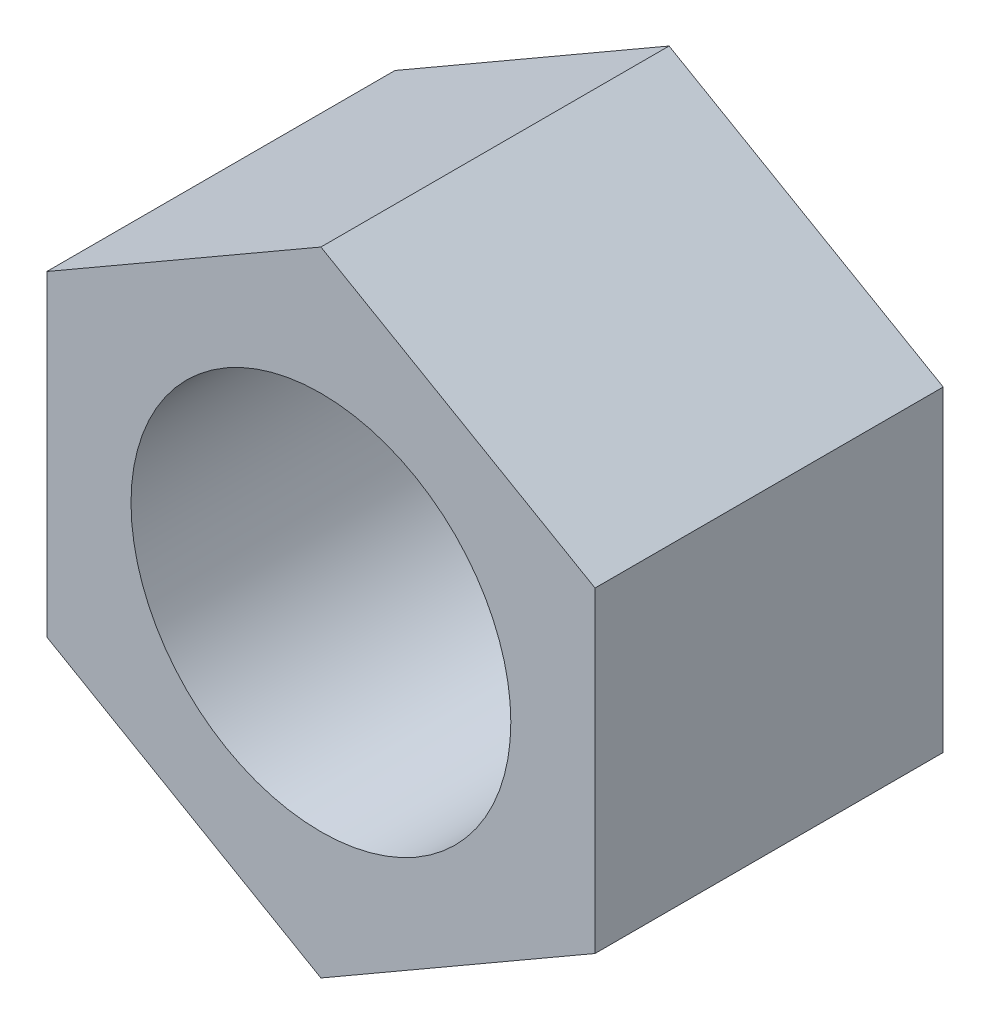
ISO-10303-21;
HEADER;
FILE_DESCRIPTION(('STEP AP214'),'2;1');
FILE_NAME('part.step','',(''),(''),'','','');
FILE_SCHEMA(('AUTOMOTIVE_DESIGN { 1 0 10303 214 1 1 1 1 }'));
ENDSEC;
DATA;
#1=APPLICATION_CONTEXT('core data for automotive mechanical design processes');
#2=APPLICATION_PROTOCOL_DEFINITION('international standard','automotive_design',2000,#1);
#3=PRODUCT_CONTEXT('',#1,'mechanical');
#4=PRODUCT('Part','Part','',(#3));
#5=PRODUCT_RELATED_PRODUCT_CATEGORY('part','',(#4));
#6=PRODUCT_DEFINITION_FORMATION('','',#4);
#7=PRODUCT_DEFINITION_CONTEXT('part definition',#1,'design');
#8=PRODUCT_DEFINITION('design','',#6,#7);
#9=PRODUCT_DEFINITION_SHAPE('','',#8);
#10=(LENGTH_UNIT() NAMED_UNIT(*) SI_UNIT(.MILLI.,.METRE.));
#11=(NAMED_UNIT(*) PLANE_ANGLE_UNIT() SI_UNIT($,.RADIAN.));
#12=(NAMED_UNIT(*) SI_UNIT($,.STERADIAN.) SOLID_ANGLE_UNIT());
#13=UNCERTAINTY_MEASURE_WITH_UNIT(LENGTH_MEASURE(1.E-05),#10,'distance_accuracy_value','');
#14=(GEOMETRIC_REPRESENTATION_CONTEXT(3) GLOBAL_UNCERTAINTY_ASSIGNED_CONTEXT((#13)) GLOBAL_UNIT_ASSIGNED_CONTEXT((#10,
#11,#12)) REPRESENTATION_CONTEXT('',''));
#15=CARTESIAN_POINT('',(0.,0.,0.));
#16=DIRECTION('',(0.,0.,1.));
#17=DIRECTION('',(1.,0.,0.));
#18=AXIS2_PLACEMENT_3D('',#15,#16,#17);
#19=CARTESIAN_POINT('',(4.33012701892216,2.50000000000005,5.5));
#20=DIRECTION('',(-0.499999999999995,-0.866025403784441,0.));
#21=DIRECTION('',(0.866025403784441,-0.499999999999995,0.));
#22=AXIS2_PLACEMENT_3D('',#19,#20,#21);
#23=PLANE('',#22);
#24=DIRECTION('',(-0.866025403784441,0.499999999999995,0.));
#25=VECTOR('',#24,1.);
#26=CARTESIAN_POINT('',(4.33012701892216,2.50000000000005,0.));
#27=LINE('',#26,#25);
#28=CARTESIAN_POINT('',(4.33012701892216,2.50000000000005,0.));
#29=VERTEX_POINT('',#28);
#30=CARTESIAN_POINT('',(0.,5.,0.));
#31=VERTEX_POINT('',#30);
#32=EDGE_CURVE('E134',#29,#31,#27,.T.);
#33=ORIENTED_EDGE('',*,*,#32,.T.);
#34=DIRECTION('',(0.,0.,-1.));
#35=VECTOR('',#34,1.);
#36=CARTESIAN_POINT('',(0.,5.,5.5));
#37=LINE('',#36,#35);
#38=CARTESIAN_POINT('',(0.,5.,5.5));
#39=VERTEX_POINT('',#38);
#40=EDGE_CURVE('E11',#39,#31,#37,.T.);
#41=ORIENTED_EDGE('',*,*,#40,.F.);
#42=DIRECTION('',(-0.866025403784441,0.499999999999995,0.));
#43=VECTOR('',#42,1.);
#44=CARTESIAN_POINT('',(4.33012701892216,2.50000000000005,5.5));
#45=LINE('',#44,#43);
#46=CARTESIAN_POINT('',(4.33012701892216,2.50000000000005,5.5));
#47=VERTEX_POINT('',#46);
#48=EDGE_CURVE('E151',#47,#39,#45,.T.);
#49=ORIENTED_EDGE('',*,*,#48,.F.);
#50=DIRECTION('',(0.,0.,-1.));
#51=VECTOR('',#50,1.);
#52=CARTESIAN_POINT('',(4.33012701892216,2.50000000000005,5.5));
#53=LINE('',#52,#51);
#54=EDGE_CURVE('E130',#47,#29,#53,.T.);
#55=ORIENTED_EDGE('',*,*,#54,.T.);
#56=EDGE_LOOP('',(#33,#41,#49,#55));
#57=FACE_BOUND('',#56,.T.);
#58=ADVANCED_FACE('F45',(#57),#23,.F.);
#59=CARTESIAN_POINT('',(0.,5.,5.5));
#60=DIRECTION('',(0.500000000000001,-0.866025403784438,0.));
#61=DIRECTION('',(0.866025403784438,0.500000000000001,0.));
#62=AXIS2_PLACEMENT_3D('',#59,#60,#61);
#63=PLANE('',#62);
#64=DIRECTION('',(-0.866025403784438,-0.500000000000001,0.));
#65=VECTOR('',#64,1.);
#66=CARTESIAN_POINT('',(0.,5.,0.));
#67=LINE('',#66,#65);
#68=CARTESIAN_POINT('',(-4.3301270189222,2.49999999999999,0.));
#69=VERTEX_POINT('',#68);
#70=EDGE_CURVE('E138',#31,#69,#67,.T.);
#71=ORIENTED_EDGE('',*,*,#70,.T.);
#72=DIRECTION('',(0.,0.,-1.));
#73=VECTOR('',#72,1.);
#74=CARTESIAN_POINT('',(-4.3301270189222,2.49999999999999,5.5));
#75=LINE('',#74,#73);
#76=CARTESIAN_POINT('',(-4.3301270189222,2.49999999999999,5.5));
#77=VERTEX_POINT('',#76);
#78=EDGE_CURVE('E54',#77,#69,#75,.T.);
#79=ORIENTED_EDGE('',*,*,#78,.F.);
#80=DIRECTION('',(-0.866025403784438,-0.500000000000001,0.));
#81=VECTOR('',#80,1.);
#82=CARTESIAN_POINT('',(0.,5.,5.5));
#83=LINE('',#82,#81);
#84=EDGE_CURVE('E99',#39,#77,#83,.T.);
#85=ORIENTED_EDGE('',*,*,#84,.F.);
#86=ORIENTED_EDGE('',*,*,#40,.T.);
#87=EDGE_LOOP('',(#71,#79,#85,#86));
#88=FACE_BOUND('',#87,.T.);
#89=ADVANCED_FACE('F180',(#88),#63,.F.);
#90=CARTESIAN_POINT('',(-4.3301270189222,2.49999999999999,5.5));
#91=DIRECTION('',(1.,0.,0.));
#92=DIRECTION('',(0.,1.,0.));
#93=AXIS2_PLACEMENT_3D('',#90,#91,#92);
#94=PLANE('',#93);
#95=DIRECTION('',(0.,-1.,0.));
#96=VECTOR('',#95,1.);
#97=CARTESIAN_POINT('',(-4.3301270189222,2.49999999999999,0.));
#98=LINE('',#97,#96);
#99=CARTESIAN_POINT('',(-4.33012701892218,-2.50000000000002,0.));
#100=VERTEX_POINT('',#99);
#101=EDGE_CURVE('E142',#69,#100,#98,.T.);
#102=ORIENTED_EDGE('',*,*,#101,.T.);
#103=DIRECTION('',(0.,0.,-1.));
#104=VECTOR('',#103,1.);
#105=CARTESIAN_POINT('',(-4.33012701892218,-2.50000000000002,5.5));
#106=LINE('',#105,#104);
#107=CARTESIAN_POINT('',(-4.33012701892218,-2.50000000000002,5.5));
#108=VERTEX_POINT('',#107);
#109=EDGE_CURVE('E123',#108,#100,#106,.T.);
#110=ORIENTED_EDGE('',*,*,#109,.F.);
#111=DIRECTION('',(0.,-1.,0.));
#112=VECTOR('',#111,1.);
#113=CARTESIAN_POINT('',(-4.3301270189222,2.49999999999999,5.5));
#114=LINE('',#113,#112);
#115=EDGE_CURVE('E112',#77,#108,#114,.T.);
#116=ORIENTED_EDGE('',*,*,#115,.F.);
#117=ORIENTED_EDGE('',*,*,#78,.T.);
#118=EDGE_LOOP('',(#102,#110,#116,#117));
#119=FACE_BOUND('',#118,.T.);
#120=ADVANCED_FACE('F161',(#119),#94,.F.);
#121=CARTESIAN_POINT('',(-4.33012701892218,-2.50000000000002,5.5));
#122=DIRECTION('',(0.499999999999995,0.866025403784442,0.));
#123=DIRECTION('',(-0.866025403784441,0.499999999999995,0.));
#124=AXIS2_PLACEMENT_3D('',#121,#122,#123);
#125=PLANE('',#124);
#126=DIRECTION('',(0.866025403784442,-0.499999999999995,0.));
#127=VECTOR('',#126,1.);
#128=CARTESIAN_POINT('',(-4.33012701892218,-2.50000000000002,0.));
#129=LINE('',#128,#127);
#130=CARTESIAN_POINT('',(0.,-5.,0.));
#131=VERTEX_POINT('',#130);
#132=EDGE_CURVE('E121',#100,#131,#129,.T.);
#133=ORIENTED_EDGE('',*,*,#132,.T.);
#134=DIRECTION('',(0.,0.,-1.));
#135=VECTOR('',#134,1.);
#136=CARTESIAN_POINT('',(0.,-5.,5.5));
#137=LINE('',#136,#135);
#138=CARTESIAN_POINT('',(0.,-5.,5.5));
#139=VERTEX_POINT('',#138);
#140=EDGE_CURVE('E118',#139,#131,#137,.T.);
#141=ORIENTED_EDGE('',*,*,#140,.F.);
#142=DIRECTION('',(0.866025403784442,-0.499999999999995,0.));
#143=VECTOR('',#142,1.);
#144=CARTESIAN_POINT('',(-4.33012701892218,-2.50000000000002,5.5));
#145=LINE('',#144,#143);
#146=EDGE_CURVE('E106',#108,#139,#145,.T.);
#147=ORIENTED_EDGE('',*,*,#146,.F.);
#148=ORIENTED_EDGE('',*,*,#109,.T.);
#149=EDGE_LOOP('',(#133,#141,#147,#148));
#150=FACE_BOUND('',#149,.T.);
#151=ADVANCED_FACE('F119',(#150),#125,.F.);
#152=CARTESIAN_POINT('',(0.,-5.,5.5));
#153=DIRECTION('',(-0.500000000000007,0.866025403784435,0.));
#154=DIRECTION('',(-0.866025403784434,-0.500000000000007,0.));
#155=AXIS2_PLACEMENT_3D('',#152,#153,#154);
#156=PLANE('',#155);
#157=DIRECTION('',(0.866025403784434,0.500000000000007,0.));
#158=VECTOR('',#157,1.);
#159=CARTESIAN_POINT('',(0.,-5.,0.));
#160=LINE('',#159,#158);
#161=CARTESIAN_POINT('',(4.33012701892222,-2.49999999999996,0.));
#162=VERTEX_POINT('',#161);
#163=EDGE_CURVE('E85',#131,#162,#160,.T.);
#164=ORIENTED_EDGE('',*,*,#163,.T.);
#165=DIRECTION('',(0.,0.,-1.));
#166=VECTOR('',#165,1.);
#167=CARTESIAN_POINT('',(4.33012701892222,-2.49999999999996,5.5));
#168=LINE('',#167,#166);
#169=CARTESIAN_POINT('',(4.33012701892222,-2.49999999999996,5.5));
#170=VERTEX_POINT('',#169);
#171=EDGE_CURVE('E124',#170,#162,#168,.T.);
#172=ORIENTED_EDGE('',*,*,#171,.F.);
#173=DIRECTION('',(0.866025403784434,0.500000000000007,0.));
#174=VECTOR('',#173,1.);
#175=CARTESIAN_POINT('',(0.,-5.,5.5));
#176=LINE('',#175,#174);
#177=EDGE_CURVE('E110',#139,#170,#176,.T.);
#178=ORIENTED_EDGE('',*,*,#177,.F.);
#179=ORIENTED_EDGE('',*,*,#140,.T.);
#180=EDGE_LOOP('',(#164,#172,#178,#179));
#181=FACE_BOUND('',#180,.T.);
#182=ADVANCED_FACE('F126',(#181),#156,.F.);
#183=CARTESIAN_POINT('',(4.33012701892222,-2.49999999999996,5.5));
#184=DIRECTION('',(-1.,0.,0.));
#185=DIRECTION('',(0.,-1.,0.));
#186=AXIS2_PLACEMENT_3D('',#183,#184,#185);
#187=PLANE('',#186);
#188=DIRECTION('',(0.,1.,0.));
#189=VECTOR('',#188,1.);
#190=CARTESIAN_POINT('',(4.33012701892222,-2.49999999999996,0.));
#191=LINE('',#190,#189);
#192=EDGE_CURVE('E91',#162,#29,#191,.T.);
#193=ORIENTED_EDGE('',*,*,#192,.T.);
#194=ORIENTED_EDGE('',*,*,#54,.F.);
#195=DIRECTION('',(0.,1.,0.));
#196=VECTOR('',#195,1.);
#197=CARTESIAN_POINT('',(4.33012701892222,-2.49999999999996,5.5));
#198=LINE('',#197,#196);
#199=EDGE_CURVE('E62',#170,#47,#198,.T.);
#200=ORIENTED_EDGE('',*,*,#199,.F.);
#201=ORIENTED_EDGE('',*,*,#171,.T.);
#202=EDGE_LOOP('',(#193,#194,#200,#201));
#203=FACE_BOUND('',#202,.T.);
#204=ADVANCED_FACE('F168',(#203),#187,.F.);
#205=CARTESIAN_POINT('',(0.,0.,5.5));
#206=DIRECTION('',(0.,0.,1.));
#207=DIRECTION('',(1.,0.,0.));
#208=AXIS2_PLACEMENT_3D('',#205,#206,#207);
#209=PLANE('',#208);
#210=CARTESIAN_POINT('',(0.,0.,5.5));
#211=DIRECTION('',(0.,0.,1.));
#212=DIRECTION('',(1.,0.,0.));
#213=AXIS2_PLACEMENT_3D('',#210,#211,#212);
#214=CIRCLE('',#213,3.);
#215=CARTESIAN_POINT('',(3.,0.,5.5));
#216=VERTEX_POINT('',#215);
#217=EDGE_CURVE('E234',#216,#216,#214,.T.);
#218=ORIENTED_EDGE('',*,*,#217,.F.);
#219=EDGE_LOOP('',(#218));
#220=FACE_BOUND('',#219,.T.);
#221=ORIENTED_EDGE('',*,*,#48,.T.);
#222=ORIENTED_EDGE('',*,*,#84,.T.);
#223=ORIENTED_EDGE('',*,*,#115,.T.);
#224=ORIENTED_EDGE('',*,*,#146,.T.);
#225=ORIENTED_EDGE('',*,*,#177,.T.);
#226=ORIENTED_EDGE('',*,*,#199,.T.);
#227=EDGE_LOOP('',(#221,#222,#223,#224,#225,#226));
#228=FACE_BOUND('',#227,.T.);
#229=ADVANCED_FACE('F108',(#220,#228),#209,.T.);
#230=CARTESIAN_POINT('',(0.,0.,0.));
#231=DIRECTION('',(0.,0.,1.));
#232=DIRECTION('',(1.,0.,0.));
#233=AXIS2_PLACEMENT_3D('',#230,#231,#232);
#234=PLANE('',#233);
#235=CARTESIAN_POINT('',(0.,0.,0.));
#236=DIRECTION('',(0.,0.,1.));
#237=DIRECTION('',(1.,0.,0.));
#238=AXIS2_PLACEMENT_3D('',#235,#236,#237);
#239=CIRCLE('',#238,3.);
#240=CARTESIAN_POINT('',(3.,0.,0.));
#241=VERTEX_POINT('',#240);
#242=EDGE_CURVE('E139',#241,#241,#239,.F.);
#243=ORIENTED_EDGE('',*,*,#242,.F.);
#244=EDGE_LOOP('',(#243));
#245=FACE_BOUND('',#244,.T.);
#246=ORIENTED_EDGE('',*,*,#32,.F.);
#247=ORIENTED_EDGE('',*,*,#192,.F.);
#248=ORIENTED_EDGE('',*,*,#163,.F.);
#249=ORIENTED_EDGE('',*,*,#132,.F.);
#250=ORIENTED_EDGE('',*,*,#101,.F.);
#251=ORIENTED_EDGE('',*,*,#70,.F.);
#252=EDGE_LOOP('',(#246,#247,#248,#249,#250,#251));
#253=FACE_BOUND('',#252,.T.);
#254=ADVANCED_FACE('F164',(#245,#253),#234,.F.);
#255=CARTESIAN_POINT('',(0.,0.,-0.00100000000000013));
#256=DIRECTION('',(0.,0.,1.));
#257=DIRECTION('',(1.,0.,0.));
#258=AXIS2_PLACEMENT_3D('',#255,#256,#257);
#259=CYLINDRICAL_SURFACE('',#258,3.);
#260=CARTESIAN_POINT('',(3.,0.,5.5));
#261=CARTESIAN_POINT('',(3.,0.,5.44270833333333));
#262=CARTESIAN_POINT('',(3.,0.,5.38541666666667));
#263=CARTESIAN_POINT('',(3.,0.,5.27083333333333));
#264=CARTESIAN_POINT('',(3.,0.,5.21354166666667));
#265=CARTESIAN_POINT('',(3.,0.,5.09895833333333));
#266=CARTESIAN_POINT('',(3.,0.,5.04166666666667));
#267=CARTESIAN_POINT('',(3.,0.,4.92708333333333));
#268=CARTESIAN_POINT('',(3.,0.,4.86979166666667));
#269=CARTESIAN_POINT('',(3.,0.,4.75520833333333));
#270=CARTESIAN_POINT('',(3.,0.,4.69791666666667));
#271=CARTESIAN_POINT('',(3.,0.,4.58333333333333));
#272=CARTESIAN_POINT('',(3.,0.,4.52604166666667));
#273=CARTESIAN_POINT('',(3.,0.,4.41145833333333));
#274=CARTESIAN_POINT('',(3.,0.,4.35416666666667));
#275=CARTESIAN_POINT('',(3.,0.,4.23958333333333));
#276=CARTESIAN_POINT('',(3.,0.,4.18229166666667));
#277=CARTESIAN_POINT('',(3.,0.,4.06770833333333));
#278=CARTESIAN_POINT('',(3.,0.,4.01041666666667));
#279=CARTESIAN_POINT('',(3.,0.,3.89583333333333));
#280=CARTESIAN_POINT('',(3.,0.,3.83854166666667));
#281=CARTESIAN_POINT('',(3.,0.,3.72395833333333));
#282=CARTESIAN_POINT('',(3.,0.,3.66666666666667));
#283=CARTESIAN_POINT('',(3.,0.,3.55208333333333));
#284=CARTESIAN_POINT('',(3.,0.,3.49479166666667));
#285=CARTESIAN_POINT('',(3.,0.,3.38020833333333));
#286=CARTESIAN_POINT('',(3.,0.,3.32291666666667));
#287=CARTESIAN_POINT('',(3.,0.,3.20833333333333));
#288=CARTESIAN_POINT('',(3.,0.,3.15104166666667));
#289=CARTESIAN_POINT('',(3.,0.,3.03645833333333));
#290=CARTESIAN_POINT('',(3.,0.,2.97916666666667));
#291=CARTESIAN_POINT('',(3.,0.,2.86458333333333));
#292=CARTESIAN_POINT('',(3.,0.,2.80729166666667));
#293=CARTESIAN_POINT('',(3.,0.,2.69270833333333));
#294=CARTESIAN_POINT('',(3.,0.,2.63541666666667));
#295=CARTESIAN_POINT('',(3.,0.,2.52083333333333));
#296=CARTESIAN_POINT('',(3.,0.,2.46354166666667));
#297=CARTESIAN_POINT('',(3.,0.,2.34895833333333));
#298=CARTESIAN_POINT('',(3.,0.,2.29166666666667));
#299=CARTESIAN_POINT('',(3.,0.,2.17708333333333));
#300=CARTESIAN_POINT('',(3.,0.,2.11979166666667));
#301=CARTESIAN_POINT('',(3.,0.,2.00520833333333));
#302=CARTESIAN_POINT('',(3.,0.,1.94791666666667));
#303=CARTESIAN_POINT('',(3.,0.,1.83333333333333));
#304=CARTESIAN_POINT('',(3.,0.,1.77604166666667));
#305=CARTESIAN_POINT('',(3.,0.,1.66145833333333));
#306=CARTESIAN_POINT('',(3.,0.,1.60416666666667));
#307=CARTESIAN_POINT('',(3.,0.,1.48958333333333));
#308=CARTESIAN_POINT('',(3.,0.,1.43229166666667));
#309=CARTESIAN_POINT('',(3.,0.,1.31770833333333));
#310=CARTESIAN_POINT('',(3.,0.,1.26041666666667));
#311=CARTESIAN_POINT('',(3.,0.,1.14583333333333));
#312=CARTESIAN_POINT('',(3.,0.,1.08854166666667));
#313=CARTESIAN_POINT('',(3.,0.,0.973958333333333));
#314=CARTESIAN_POINT('',(3.,0.,0.916666666666666));
#315=CARTESIAN_POINT('',(3.,0.,0.802083333333333));
#316=CARTESIAN_POINT('',(3.,0.,0.744791666666666));
#317=CARTESIAN_POINT('',(3.,0.,0.630208333333333));
#318=CARTESIAN_POINT('',(3.,0.,0.572916666666667));
#319=CARTESIAN_POINT('',(3.,0.,0.458333333333334));
#320=CARTESIAN_POINT('',(3.,0.,0.401041666666667));
#321=CARTESIAN_POINT('',(3.,0.,0.286458333333334));
#322=CARTESIAN_POINT('',(3.,0.,0.229166666666667));
#323=CARTESIAN_POINT('',(3.,0.,0.114583333333333));
#324=CARTESIAN_POINT('',(3.,0.,0.0572916666666668));
#325=CARTESIAN_POINT('',(3.,0.,0.));
#326=B_SPLINE_CURVE_WITH_KNOTS('',3,(#260,#261,#262,#263,#264,#265,#266,#267,#268,#269,#270,
#271,#272,#273,#274,#275,#276,#277,#278,#279,#280,#281,#282,#283,#284,#285,#286,#287,#288,#289,
#290,#291,#292,#293,#294,#295,#296,#297,#298,#299,#300,#301,#302,#303,#304,#305,#306,#307,#308,
#309,#310,#311,#312,#313,#314,#315,#316,#317,#318,#319,#320,#321,#322,#323,#324,#325),
.UNSPECIFIED.,.F.,.F.,(4,2,2,2,2,2,2,2,2,2,2,2,2,2,2,2,2,2,2,2,2,2,2,2,2,2,2,2,2,2,2,2,4),(0.,
0.171875,0.34375,0.515625,0.6875,0.859375,1.03125,1.203125,1.375,1.546875,1.71875,1.890625,
2.0625,2.234375,2.40625,2.578125,2.75,2.921875,3.09375,3.265625,3.4375,3.609375,3.78125,
3.953125,4.125,4.296875,4.46875,4.640625,4.8125,4.984375,5.15625,5.328125,5.5),.UNSPECIFIED.);
#327=EDGE_CURVE('BSEAM219',#216,#241,#326,.T.);
#328=ORIENTED_EDGE('',*,*,#217,.T.);
#329=ORIENTED_EDGE('',*,*,#242,.T.);
#330=ORIENTED_EDGE('',*,*,#327,.T.);
#331=ORIENTED_EDGE('',*,*,#327,.F.);
#332=EDGE_LOOP('',(#328,#330,#329,#331));
#333=FACE_BOUND('',#332,.T.);
#334=ADVANCED_FACE('F219',(#333),#259,.F.);
#335=CLOSED_SHELL('',(#58,#89,#120,#151,#182,#204,#229,#254,#334));
#336=MANIFOLD_SOLID_BREP('B2',#335);
#337=ADVANCED_BREP_SHAPE_REPRESENTATION('',(#18,#336),#14);
#338=SHAPE_DEFINITION_REPRESENTATION(#9,#337);
ENDSEC;
END-ISO-10303-21;
